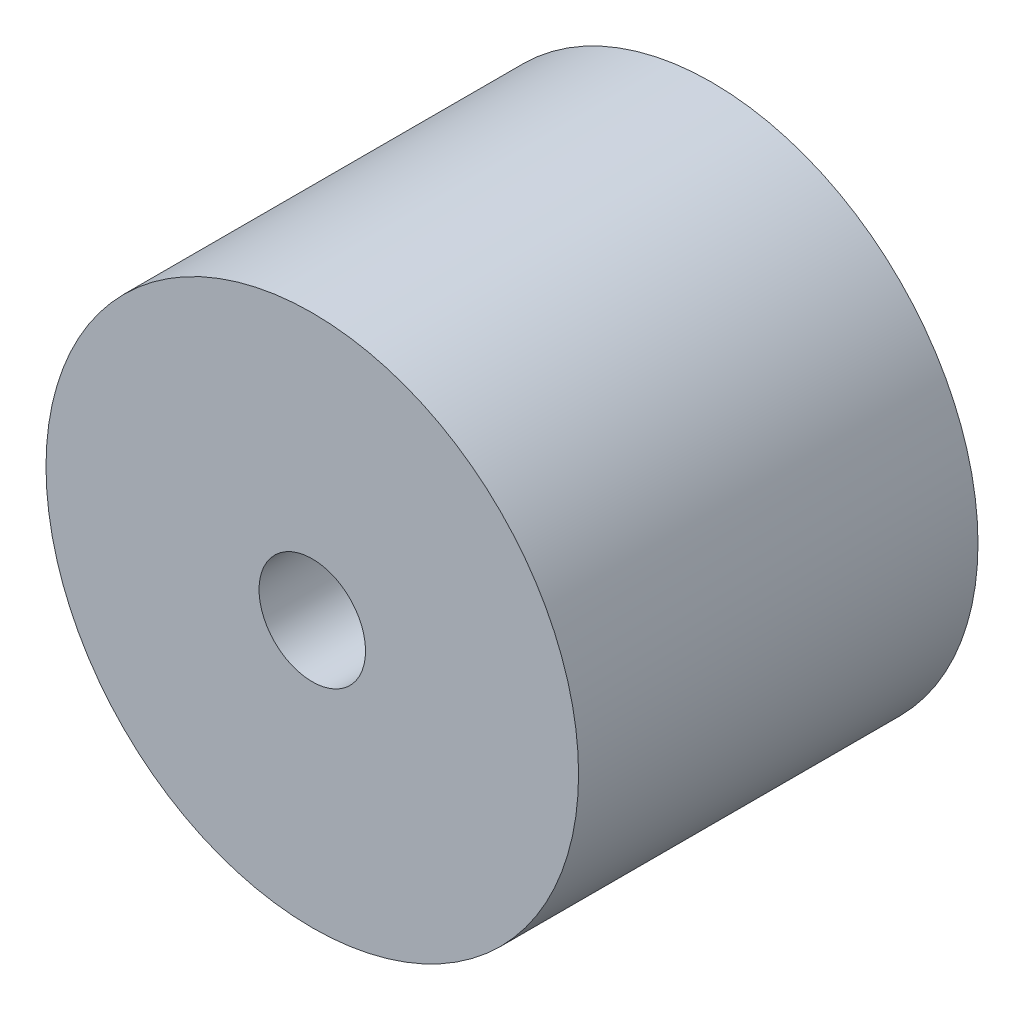
ISO-10303-21;
HEADER;
FILE_DESCRIPTION(('STEP AP214'),'2;1');
FILE_NAME('part.step','',(''),(''),'','','');
FILE_SCHEMA(('AUTOMOTIVE_DESIGN { 1 0 10303 214 1 1 1 1 }'));
ENDSEC;
DATA;
#1=APPLICATION_CONTEXT('core data for automotive mechanical design processes');
#2=APPLICATION_PROTOCOL_DEFINITION('international standard','automotive_design',2000,#1);
#3=PRODUCT_CONTEXT('',#1,'mechanical');
#4=PRODUCT('Part','Part','',(#3));
#5=PRODUCT_RELATED_PRODUCT_CATEGORY('part','',(#4));
#6=PRODUCT_DEFINITION_FORMATION('','',#4);
#7=PRODUCT_DEFINITION_CONTEXT('part definition',#1,'design');
#8=PRODUCT_DEFINITION('design','',#6,#7);
#9=PRODUCT_DEFINITION_SHAPE('','',#8);
#10=(LENGTH_UNIT() NAMED_UNIT(*) SI_UNIT(.MILLI.,.METRE.));
#11=(NAMED_UNIT(*) PLANE_ANGLE_UNIT() SI_UNIT($,.RADIAN.));
#12=(NAMED_UNIT(*) SI_UNIT($,.STERADIAN.) SOLID_ANGLE_UNIT());
#13=UNCERTAINTY_MEASURE_WITH_UNIT(LENGTH_MEASURE(1.E-05),#10,'distance_accuracy_value','');
#14=(GEOMETRIC_REPRESENTATION_CONTEXT(3) GLOBAL_UNCERTAINTY_ASSIGNED_CONTEXT((#13)) GLOBAL_UNIT_ASSIGNED_CONTEXT((#10,
#11,#12)) REPRESENTATION_CONTEXT('',''));
#15=CARTESIAN_POINT('',(0.,0.,0.));
#16=DIRECTION('',(0.,0.,1.));
#17=DIRECTION('',(1.,0.,0.));
#18=AXIS2_PLACEMENT_3D('',#15,#16,#17);
#19=CARTESIAN_POINT('',(0.,0.,15.));
#20=DIRECTION('',(0.,0.,-1.));
#21=DIRECTION('',(-1.,0.,0.));
#22=AXIS2_PLACEMENT_3D('',#19,#20,#21);
#23=CYLINDRICAL_SURFACE('',#22,10.);
#24=CARTESIAN_POINT('',(0.,0.,15.));
#25=DIRECTION('',(0.,0.,1.));
#26=DIRECTION('',(1.,0.,0.));
#27=AXIS2_PLACEMENT_3D('',#24,#25,#26);
#28=CIRCLE('',#27,10.);
#29=CARTESIAN_POINT('',(10.,0.,15.));
#30=VERTEX_POINT('',#29);
#31=EDGE_CURVE('E10',#30,#30,#28,.T.);
#32=ORIENTED_EDGE('',*,*,#31,.F.);
#33=EDGE_LOOP('',(#32));
#34=FACE_BOUND('',#33,.T.);
#35=CARTESIAN_POINT('',(0.,0.,0.));
#36=DIRECTION('',(0.,0.,1.));
#37=DIRECTION('',(1.,0.,0.));
#38=AXIS2_PLACEMENT_3D('',#35,#36,#37);
#39=CIRCLE('',#38,10.);
#40=CARTESIAN_POINT('',(10.,0.,0.));
#41=VERTEX_POINT('',#40);
#42=EDGE_CURVE('E36',#41,#41,#39,.T.);
#43=ORIENTED_EDGE('',*,*,#42,.T.);
#44=EDGE_LOOP('',(#43));
#45=FACE_BOUND('',#44,.T.);
#46=ADVANCED_FACE('F33',(#34,#45),#23,.T.);
#47=CARTESIAN_POINT('',(0.,0.,15.));
#48=DIRECTION('',(0.,0.,1.));
#49=DIRECTION('',(1.,0.,0.));
#50=AXIS2_PLACEMENT_3D('',#47,#48,#49);
#51=PLANE('',#50);
#52=CARTESIAN_POINT('',(0.,0.,15.));
#53=DIRECTION('',(0.,0.,1.));
#54=DIRECTION('',(1.,0.,0.));
#55=AXIS2_PLACEMENT_3D('',#52,#53,#54);
#56=CIRCLE('',#55,2.);
#57=CARTESIAN_POINT('',(2.,0.,15.));
#58=VERTEX_POINT('',#57);
#59=EDGE_CURVE('E45',#58,#58,#56,.T.);
#60=ORIENTED_EDGE('',*,*,#59,.F.);
#61=EDGE_LOOP('',(#60));
#62=FACE_BOUND('',#61,.T.);
#63=ORIENTED_EDGE('',*,*,#31,.T.);
#64=EDGE_LOOP('',(#63));
#65=FACE_BOUND('',#64,.T.);
#66=ADVANCED_FACE('F60',(#62,#65),#51,.T.);
#67=CARTESIAN_POINT('',(0.,0.,0.));
#68=DIRECTION('',(0.,0.,1.));
#69=DIRECTION('',(1.,0.,0.));
#70=AXIS2_PLACEMENT_3D('',#67,#68,#69);
#71=PLANE('',#70);
#72=ORIENTED_EDGE('',*,*,#42,.F.);
#73=EDGE_LOOP('',(#72));
#74=FACE_BOUND('',#73,.T.);
#75=ADVANCED_FACE('F56',(#74),#71,.F.);
#76=CARTESIAN_POINT('',(0.,0.,9.00000000000001));
#77=DIRECTION('',(0.,0.,1.));
#78=DIRECTION('',(1.,0.,0.));
#79=AXIS2_PLACEMENT_3D('',#76,#77,#78);
#80=CYLINDRICAL_SURFACE('',#79,2.);
#81=CARTESIAN_POINT('',(0.,0.,9.00000000000001));
#82=DIRECTION('',(0.,0.,1.));
#83=DIRECTION('',(1.,0.,0.));
#84=AXIS2_PLACEMENT_3D('',#81,#82,#83);
#85=CIRCLE('',#84,2.);
#86=CARTESIAN_POINT('',(2.,0.,9.00000000000001));
#87=VERTEX_POINT('',#86);
#88=EDGE_CURVE('E43',#87,#87,#85,.T.);
#89=ORIENTED_EDGE('',*,*,#88,.F.);
#90=EDGE_LOOP('',(#89));
#91=FACE_BOUND('',#90,.T.);
#92=ORIENTED_EDGE('',*,*,#59,.T.);
#93=EDGE_LOOP('',(#92));
#94=FACE_BOUND('',#93,.T.);
#95=ADVANCED_FACE('F53',(#91,#94),#80,.F.);
#96=CARTESIAN_POINT('',(0.,0.,9.00000000000001));
#97=DIRECTION('',(0.,0.,1.));
#98=DIRECTION('',(1.,0.,0.));
#99=AXIS2_PLACEMENT_3D('',#96,#97,#98);
#100=PLANE('',#99);
#101=ORIENTED_EDGE('',*,*,#88,.T.);
#102=EDGE_LOOP('',(#101));
#103=FACE_BOUND('',#102,.T.);
#104=ADVANCED_FACE('F51',(#103),#100,.T.);
#105=CLOSED_SHELL('',(#46,#66,#75,#95,#104));
#106=MANIFOLD_SOLID_BREP('B2',#105);
#107=ADVANCED_BREP_SHAPE_REPRESENTATION('',(#18,#106),#14);
#108=SHAPE_DEFINITION_REPRESENTATION(#9,#107);
ENDSEC;
END-ISO-10303-21;
